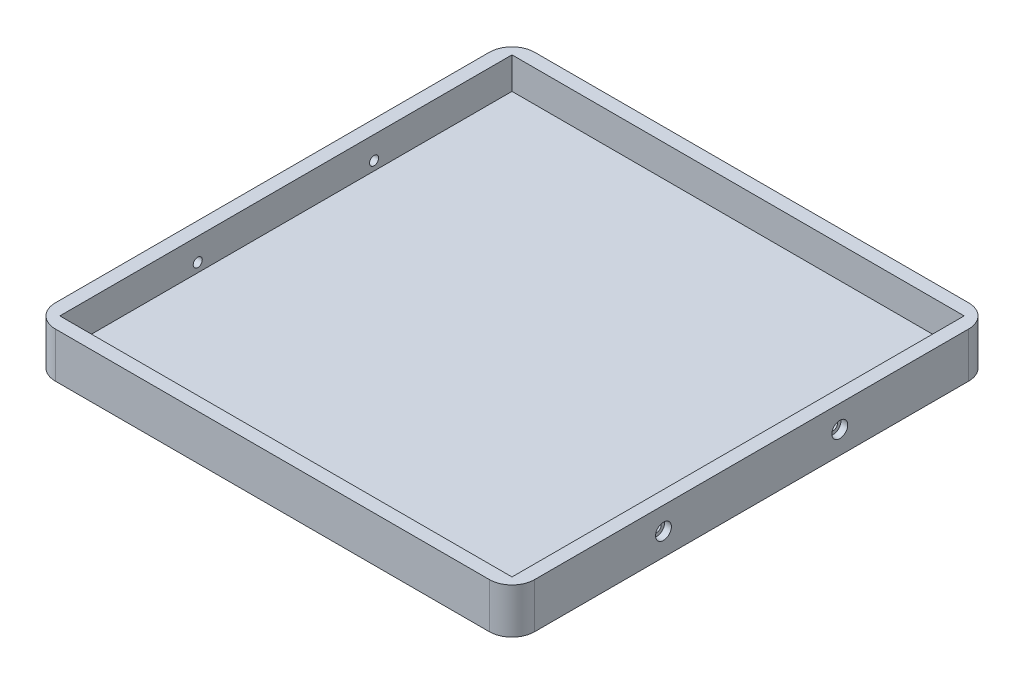
ISO-10303-21;
HEADER;
FILE_DESCRIPTION(('STEP AP214'),'2;1');
FILE_NAME('part.step','',(''),(''),'','','');
FILE_SCHEMA(('AUTOMOTIVE_DESIGN { 1 0 10303 214 1 1 1 1 }'));
ENDSEC;
DATA;
#1=APPLICATION_CONTEXT('core data for automotive mechanical design processes');
#2=APPLICATION_PROTOCOL_DEFINITION('international standard','automotive_design',2000,#1);
#3=PRODUCT_CONTEXT('',#1,'mechanical');
#4=PRODUCT('Part','Part','',(#3));
#5=PRODUCT_RELATED_PRODUCT_CATEGORY('part','',(#4));
#6=PRODUCT_DEFINITION_FORMATION('','',#4);
#7=PRODUCT_DEFINITION_CONTEXT('part definition',#1,'design');
#8=PRODUCT_DEFINITION('design','',#6,#7);
#9=PRODUCT_DEFINITION_SHAPE('','',#8);
#10=(LENGTH_UNIT() NAMED_UNIT(*) SI_UNIT(.MILLI.,.METRE.));
#11=(NAMED_UNIT(*) PLANE_ANGLE_UNIT() SI_UNIT($,.RADIAN.));
#12=(NAMED_UNIT(*) SI_UNIT($,.STERADIAN.) SOLID_ANGLE_UNIT());
#13=UNCERTAINTY_MEASURE_WITH_UNIT(LENGTH_MEASURE(1.E-05),#10,'distance_accuracy_value','');
#14=(GEOMETRIC_REPRESENTATION_CONTEXT(3) GLOBAL_UNCERTAINTY_ASSIGNED_CONTEXT((#13)) GLOBAL_UNIT_ASSIGNED_CONTEXT((#10,
#11,#12)) REPRESENTATION_CONTEXT('',''));
#15=CARTESIAN_POINT('',(0.,0.,0.));
#16=DIRECTION('',(0.,0.,1.));
#17=DIRECTION('',(1.,0.,0.));
#18=AXIS2_PLACEMENT_3D('',#15,#16,#17);
#19=CARTESIAN_POINT('',(-64.0000000000001,5.00000000000054,-19.5));
#20=DIRECTION('',(1.,0.,0.));
#21=DIRECTION('',(0.,0.,-1.));
#22=AXIS2_PLACEMENT_3D('',#19,#20,#21);
#23=CYLINDRICAL_SURFACE('',#22,1.);
#24=CARTESIAN_POINT('',(-50.,5.00000000000054,-19.5));
#25=DIRECTION('',(-1.,0.,0.));
#26=DIRECTION('',(0.,0.,1.));
#27=AXIS2_PLACEMENT_3D('',#24,#25,#26);
#28=CIRCLE('',#27,1.);
#29=CARTESIAN_POINT('',(-50.,5.00000000000054,-18.5));
#30=VERTEX_POINT('',#29);
#31=EDGE_CURVE('E207',#30,#30,#28,.T.);
#32=ORIENTED_EDGE('',*,*,#31,.F.);
#33=EDGE_LOOP('',(#32));
#34=FACE_BOUND('',#33,.T.);
#35=CARTESIAN_POINT('',(-51.5,5.00000000000054,-19.5));
#36=DIRECTION('',(-1.,0.,0.));
#37=DIRECTION('',(0.,0.,1.));
#38=AXIS2_PLACEMENT_3D('',#35,#36,#37);
#39=CIRCLE('',#38,1.);
#40=CARTESIAN_POINT('',(-51.5,5.00000000000054,-18.5));
#41=VERTEX_POINT('',#40);
#42=EDGE_CURVE('E219',#41,#41,#39,.F.);
#43=ORIENTED_EDGE('',*,*,#42,.F.);
#44=EDGE_LOOP('',(#43));
#45=FACE_BOUND('',#44,.T.);
#46=ADVANCED_FACE('F48',(#34,#45),#23,.F.);
#47=CARTESIAN_POINT('',(-64.0000000000001,5.,19.5000000000001));
#48=DIRECTION('',(1.,0.,0.));
#49=DIRECTION('',(0.,0.,-1.));
#50=AXIS2_PLACEMENT_3D('',#47,#48,#49);
#51=CYLINDRICAL_SURFACE('',#50,1.);
#52=CARTESIAN_POINT('',(-50.,5.,19.5000000000001));
#53=DIRECTION('',(-1.,0.,0.));
#54=DIRECTION('',(0.,0.,1.));
#55=AXIS2_PLACEMENT_3D('',#52,#53,#54);
#56=CIRCLE('',#55,1.);
#57=CARTESIAN_POINT('',(-50.,5.,20.5000000000001));
#58=VERTEX_POINT('',#57);
#59=EDGE_CURVE('E212',#58,#58,#56,.T.);
#60=ORIENTED_EDGE('',*,*,#59,.F.);
#61=EDGE_LOOP('',(#60));
#62=FACE_BOUND('',#61,.T.);
#63=CARTESIAN_POINT('',(-51.5,5.,19.5000000000001));
#64=DIRECTION('',(-1.,0.,0.));
#65=DIRECTION('',(0.,0.,1.));
#66=AXIS2_PLACEMENT_3D('',#63,#64,#65);
#67=CIRCLE('',#66,1.);
#68=CARTESIAN_POINT('',(-51.5,5.,20.5000000000001));
#69=VERTEX_POINT('',#68);
#70=EDGE_CURVE('E216',#69,#69,#67,.F.);
#71=ORIENTED_EDGE('',*,*,#70,.F.);
#72=EDGE_LOOP('',(#71));
#73=FACE_BOUND('',#72,.T.);
#74=ADVANCED_FACE('F293',(#62,#73),#51,.F.);
#75=CARTESIAN_POINT('',(53.,10.,-53.));
#76=DIRECTION('',(-1.,0.,0.));
#77=DIRECTION('',(0.,0.,1.));
#78=AXIS2_PLACEMENT_3D('',#75,#76,#77);
#79=PLANE('',#78);
#80=CARTESIAN_POINT('',(53.,5.,19.5000000000001));
#81=DIRECTION('',(1.,0.,0.));
#82=DIRECTION('',(0.,0.,-1.));
#83=AXIS2_PLACEMENT_3D('',#80,#81,#82);
#84=CIRCLE('',#83,1.75);
#85=CARTESIAN_POINT('',(53.,5.,17.7500000000001));
#86=VERTEX_POINT('',#85);
#87=EDGE_CURVE('E333',#86,#86,#84,.T.);
#88=ORIENTED_EDGE('',*,*,#87,.F.);
#89=EDGE_LOOP('',(#88));
#90=FACE_BOUND('',#89,.T.);
#91=DIRECTION('',(0.,0.,-1.));
#92=VECTOR('',#91,1.);
#93=CARTESIAN_POINT('',(53.,10.,-53.));
#94=LINE('',#93,#92);
#95=CARTESIAN_POINT('',(53.,10.,48.));
#96=VERTEX_POINT('',#95);
#97=CARTESIAN_POINT('',(53.,10.,-48.));
#98=VERTEX_POINT('',#97);
#99=EDGE_CURVE('E186',#96,#98,#94,.T.);
#100=ORIENTED_EDGE('',*,*,#99,.F.);
#101=DIRECTION('',(0.,-1.,0.));
#102=VECTOR('',#101,1.);
#103=CARTESIAN_POINT('',(53.,10.,48.));
#104=LINE('',#103,#102);
#105=CARTESIAN_POINT('',(53.,0.,48.));
#106=VERTEX_POINT('',#105);
#107=EDGE_CURVE('E12',#96,#106,#104,.T.);
#108=ORIENTED_EDGE('',*,*,#107,.T.);
#109=DIRECTION('',(0.,0.,-1.));
#110=VECTOR('',#109,1.);
#111=CARTESIAN_POINT('',(53.,0.,-53.));
#112=LINE('',#111,#110);
#113=CARTESIAN_POINT('',(53.,0.,-48.));
#114=VERTEX_POINT('',#113);
#115=EDGE_CURVE('E182',#106,#114,#112,.T.);
#116=ORIENTED_EDGE('',*,*,#115,.T.);
#117=DIRECTION('',(0.,-1.,0.));
#118=VECTOR('',#117,1.);
#119=CARTESIAN_POINT('',(53.,10.,-48.));
#120=LINE('',#119,#118);
#121=EDGE_CURVE('E56',#114,#98,#120,.F.);
#122=ORIENTED_EDGE('',*,*,#121,.T.);
#123=EDGE_LOOP('',(#100,#108,#116,#122));
#124=FACE_BOUND('',#123,.T.);
#125=CARTESIAN_POINT('',(53.,5.00000000000054,-19.5));
#126=DIRECTION('',(1.,0.,0.));
#127=DIRECTION('',(0.,0.,-1.));
#128=AXIS2_PLACEMENT_3D('',#125,#126,#127);
#129=CIRCLE('',#128,1.75);
#130=CARTESIAN_POINT('',(53.,5.00000000000054,-21.25));
#131=VERTEX_POINT('',#130);
#132=EDGE_CURVE('E331',#131,#131,#129,.F.);
#133=ORIENTED_EDGE('',*,*,#132,.T.);
#134=EDGE_LOOP('',(#133));
#135=FACE_BOUND('',#134,.T.);
#136=ADVANCED_FACE('F254',(#90,#124,#135),#79,.F.);
#137=CARTESIAN_POINT('',(-53.,10.,-53.));
#138=DIRECTION('',(0.,0.,1.));
#139=DIRECTION('',(1.,0.,0.));
#140=AXIS2_PLACEMENT_3D('',#137,#138,#139);
#141=PLANE('',#140);
#142=DIRECTION('',(-1.,0.,0.));
#143=VECTOR('',#142,1.);
#144=CARTESIAN_POINT('',(-53.,0.,-53.));
#145=LINE('',#144,#143);
#146=CARTESIAN_POINT('',(48.,0.,-53.));
#147=VERTEX_POINT('',#146);
#148=CARTESIAN_POINT('',(-48.,0.,-53.));
#149=VERTEX_POINT('',#148);
#150=EDGE_CURVE('E200',#147,#149,#145,.T.);
#151=ORIENTED_EDGE('',*,*,#150,.T.);
#152=DIRECTION('',(0.,-1.,0.));
#153=VECTOR('',#152,1.);
#154=CARTESIAN_POINT('',(-48.,10.,-53.));
#155=LINE('',#154,#153);
#156=CARTESIAN_POINT('',(-48.,10.,-53.));
#157=VERTEX_POINT('',#156);
#158=EDGE_CURVE('E239',#149,#157,#155,.F.);
#159=ORIENTED_EDGE('',*,*,#158,.T.);
#160=DIRECTION('',(-1.,0.,0.));
#161=VECTOR('',#160,1.);
#162=CARTESIAN_POINT('',(-53.,10.,-53.));
#163=LINE('',#162,#161);
#164=CARTESIAN_POINT('',(48.,10.,-53.));
#165=VERTEX_POINT('',#164);
#166=EDGE_CURVE('E189',#165,#157,#163,.T.);
#167=ORIENTED_EDGE('',*,*,#166,.F.);
#168=DIRECTION('',(0.,-1.,0.));
#169=VECTOR('',#168,1.);
#170=CARTESIAN_POINT('',(48.,10.,-53.));
#171=LINE('',#170,#169);
#172=EDGE_CURVE('E236',#165,#147,#171,.T.);
#173=ORIENTED_EDGE('',*,*,#172,.T.);
#174=EDGE_LOOP('',(#151,#159,#167,#173));
#175=FACE_BOUND('',#174,.T.);
#176=ADVANCED_FACE('F266',(#175),#141,.F.);
#177=CARTESIAN_POINT('',(-53.,10.,-53.));
#178=DIRECTION('',(1.,0.,0.));
#179=DIRECTION('',(0.,0.,-1.));
#180=AXIS2_PLACEMENT_3D('',#177,#178,#179);
#181=PLANE('',#180);
#182=CARTESIAN_POINT('',(-53.,5.00000000000054,-19.5));
#183=DIRECTION('',(-1.,0.,0.));
#184=DIRECTION('',(0.,0.,1.));
#185=AXIS2_PLACEMENT_3D('',#182,#183,#184);
#186=CIRCLE('',#185,1.75);
#187=CARTESIAN_POINT('',(-53.,5.00000000000054,-17.75));
#188=VERTEX_POINT('',#187);
#189=EDGE_CURVE('E415',#188,#188,#186,.T.);
#190=ORIENTED_EDGE('',*,*,#189,.F.);
#191=EDGE_LOOP('',(#190));
#192=FACE_BOUND('',#191,.T.);
#193=CARTESIAN_POINT('',(-53.,5.,19.5000000000001));
#194=DIRECTION('',(-1.,0.,0.));
#195=DIRECTION('',(0.,0.,1.));
#196=AXIS2_PLACEMENT_3D('',#193,#194,#195);
#197=CIRCLE('',#196,1.75);
#198=CARTESIAN_POINT('',(-53.,5.,21.2500000000001));
#199=VERTEX_POINT('',#198);
#200=EDGE_CURVE('E412',#199,#199,#197,.T.);
#201=ORIENTED_EDGE('',*,*,#200,.F.);
#202=EDGE_LOOP('',(#201));
#203=FACE_BOUND('',#202,.T.);
#204=DIRECTION('',(0.,0.,1.));
#205=VECTOR('',#204,1.);
#206=CARTESIAN_POINT('',(-53.,10.,-53.));
#207=LINE('',#206,#205);
#208=CARTESIAN_POINT('',(-53.,10.,-48.));
#209=VERTEX_POINT('',#208);
#210=CARTESIAN_POINT('',(-53.,10.,48.));
#211=VERTEX_POINT('',#210);
#212=EDGE_CURVE('E193',#209,#211,#207,.T.);
#213=ORIENTED_EDGE('',*,*,#212,.F.);
#214=DIRECTION('',(0.,-1.,0.));
#215=VECTOR('',#214,1.);
#216=CARTESIAN_POINT('',(-53.,10.,-48.));
#217=LINE('',#216,#215);
#218=CARTESIAN_POINT('',(-53.,0.,-48.));
#219=VERTEX_POINT('',#218);
#220=EDGE_CURVE('E225',#209,#219,#217,.T.);
#221=ORIENTED_EDGE('',*,*,#220,.T.);
#222=DIRECTION('',(0.,0.,1.));
#223=VECTOR('',#222,1.);
#224=CARTESIAN_POINT('',(-53.,0.,-53.));
#225=LINE('',#224,#223);
#226=CARTESIAN_POINT('',(-53.,0.,48.));
#227=VERTEX_POINT('',#226);
#228=EDGE_CURVE('E203',#219,#227,#225,.T.);
#229=ORIENTED_EDGE('',*,*,#228,.T.);
#230=DIRECTION('',(0.,-1.,0.));
#231=VECTOR('',#230,1.);
#232=CARTESIAN_POINT('',(-53.,10.,48.));
#233=LINE('',#232,#231);
#234=EDGE_CURVE('E197',#227,#211,#233,.F.);
#235=ORIENTED_EDGE('',*,*,#234,.T.);
#236=EDGE_LOOP('',(#213,#221,#229,#235));
#237=FACE_BOUND('',#236,.T.);
#238=ADVANCED_FACE('F277',(#192,#203,#237),#181,.F.);
#239=CARTESIAN_POINT('',(-53.,10.,53.));
#240=DIRECTION('',(0.,0.,-1.));
#241=DIRECTION('',(-1.,0.,0.));
#242=AXIS2_PLACEMENT_3D('',#239,#240,#241);
#243=PLANE('',#242);
#244=DIRECTION('',(1.,0.,0.));
#245=VECTOR('',#244,1.);
#246=CARTESIAN_POINT('',(-53.,10.,53.));
#247=LINE('',#246,#245);
#248=CARTESIAN_POINT('',(-48.,10.,53.));
#249=VERTEX_POINT('',#248);
#250=CARTESIAN_POINT('',(48.,10.,53.));
#251=VERTEX_POINT('',#250);
#252=EDGE_CURVE('E195',#249,#251,#247,.T.);
#253=ORIENTED_EDGE('',*,*,#252,.F.);
#254=DIRECTION('',(0.,-1.,0.));
#255=VECTOR('',#254,1.);
#256=CARTESIAN_POINT('',(-48.,10.,53.));
#257=LINE('',#256,#255);
#258=CARTESIAN_POINT('',(-48.,0.,53.));
#259=VERTEX_POINT('',#258);
#260=EDGE_CURVE('E249',#249,#259,#257,.T.);
#261=ORIENTED_EDGE('',*,*,#260,.T.);
#262=DIRECTION('',(1.,0.,0.));
#263=VECTOR('',#262,1.);
#264=CARTESIAN_POINT('',(-53.,0.,53.));
#265=LINE('',#264,#263);
#266=CARTESIAN_POINT('',(48.,0.,53.));
#267=VERTEX_POINT('',#266);
#268=EDGE_CURVE('E190',#259,#267,#265,.T.);
#269=ORIENTED_EDGE('',*,*,#268,.T.);
#270=DIRECTION('',(0.,-1.,0.));
#271=VECTOR('',#270,1.);
#272=CARTESIAN_POINT('',(48.,10.,53.));
#273=LINE('',#272,#271);
#274=EDGE_CURVE('E63',#267,#251,#273,.F.);
#275=ORIENTED_EDGE('',*,*,#274,.T.);
#276=EDGE_LOOP('',(#253,#261,#269,#275));
#277=FACE_BOUND('',#276,.T.);
#278=ADVANCED_FACE('F283',(#277),#243,.F.);
#279=CARTESIAN_POINT('',(0.,10.,0.));
#280=DIRECTION('',(0.,1.,0.));
#281=DIRECTION('',(0.,0.,1.));
#282=AXIS2_PLACEMENT_3D('',#279,#280,#281);
#283=PLANE('',#282);
#284=DIRECTION('',(0.,0.,-1.));
#285=VECTOR('',#284,1.);
#286=CARTESIAN_POINT('',(50.,10.,-50.));
#287=LINE('',#286,#285);
#288=CARTESIAN_POINT('',(50.,10.,50.));
#289=VERTEX_POINT('',#288);
#290=CARTESIAN_POINT('',(50.,10.,-50.));
#291=VERTEX_POINT('',#290);
#292=EDGE_CURVE('E146',#289,#291,#287,.T.);
#293=ORIENTED_EDGE('',*,*,#292,.F.);
#294=DIRECTION('',(1.,0.,0.));
#295=VECTOR('',#294,1.);
#296=CARTESIAN_POINT('',(-50.,10.,50.));
#297=LINE('',#296,#295);
#298=CARTESIAN_POINT('',(-50.,10.,50.));
#299=VERTEX_POINT('',#298);
#300=EDGE_CURVE('E163',#299,#289,#297,.T.);
#301=ORIENTED_EDGE('',*,*,#300,.F.);
#302=DIRECTION('',(0.,0.,1.));
#303=VECTOR('',#302,1.);
#304=CARTESIAN_POINT('',(-50.,10.,-50.));
#305=LINE('',#304,#303);
#306=CARTESIAN_POINT('',(-50.,10.,-50.));
#307=VERTEX_POINT('',#306);
#308=EDGE_CURVE('E166',#307,#299,#305,.T.);
#309=ORIENTED_EDGE('',*,*,#308,.F.);
#310=DIRECTION('',(-1.,0.,0.));
#311=VECTOR('',#310,1.);
#312=CARTESIAN_POINT('',(-50.,10.,-50.));
#313=LINE('',#312,#311);
#314=EDGE_CURVE('E175',#291,#307,#313,.T.);
#315=ORIENTED_EDGE('',*,*,#314,.F.);
#316=EDGE_LOOP('',(#293,#301,#309,#315));
#317=FACE_BOUND('',#316,.T.);
#318=ORIENTED_EDGE('',*,*,#166,.T.);
#319=CARTESIAN_POINT('',(-48.,10.,-48.));
#320=DIRECTION('',(0.,1.,0.));
#321=DIRECTION('',(0.,0.,1.));
#322=AXIS2_PLACEMENT_3D('',#319,#320,#321);
#323=CIRCLE('',#322,5.);
#324=EDGE_CURVE('E246',#157,#209,#323,.T.);
#325=ORIENTED_EDGE('',*,*,#324,.T.);
#326=ORIENTED_EDGE('',*,*,#212,.T.);
#327=CARTESIAN_POINT('',(-48.,10.,48.));
#328=DIRECTION('',(0.,1.,0.));
#329=DIRECTION('',(0.,0.,1.));
#330=AXIS2_PLACEMENT_3D('',#327,#328,#329);
#331=CIRCLE('',#330,5.);
#332=EDGE_CURVE('E70',#211,#249,#331,.T.);
#333=ORIENTED_EDGE('',*,*,#332,.T.);
#334=ORIENTED_EDGE('',*,*,#252,.T.);
#335=CARTESIAN_POINT('',(48.,10.,48.));
#336=DIRECTION('',(0.,1.,0.));
#337=DIRECTION('',(0.,0.,1.));
#338=AXIS2_PLACEMENT_3D('',#335,#336,#337);
#339=CIRCLE('',#338,5.);
#340=EDGE_CURVE('E243',#251,#96,#339,.T.);
#341=ORIENTED_EDGE('',*,*,#340,.T.);
#342=ORIENTED_EDGE('',*,*,#99,.T.);
#343=CARTESIAN_POINT('',(48.,10.,-48.));
#344=DIRECTION('',(0.,1.,0.));
#345=DIRECTION('',(0.,0.,1.));
#346=AXIS2_PLACEMENT_3D('',#343,#344,#345);
#347=CIRCLE('',#346,5.);
#348=EDGE_CURVE('E241',#98,#165,#347,.T.);
#349=ORIENTED_EDGE('',*,*,#348,.T.);
#350=EDGE_LOOP('',(#318,#325,#326,#333,#334,#341,#342,#349));
#351=FACE_BOUND('',#350,.T.);
#352=ADVANCED_FACE('F260',(#317,#351),#283,.T.);
#353=CARTESIAN_POINT('',(0.,0.,0.));
#354=DIRECTION('',(0.,1.,0.));
#355=DIRECTION('',(0.,0.,1.));
#356=AXIS2_PLACEMENT_3D('',#353,#354,#355);
#357=PLANE('',#356);
#358=ORIENTED_EDGE('',*,*,#228,.F.);
#359=CARTESIAN_POINT('',(-48.,0.,-48.));
#360=DIRECTION('',(0.,1.,0.));
#361=DIRECTION('',(0.,0.,1.));
#362=AXIS2_PLACEMENT_3D('',#359,#360,#361);
#363=CIRCLE('',#362,5.);
#364=EDGE_CURVE('E234',#219,#149,#363,.F.);
#365=ORIENTED_EDGE('',*,*,#364,.T.);
#366=ORIENTED_EDGE('',*,*,#150,.F.);
#367=CARTESIAN_POINT('',(48.,0.,-48.));
#368=DIRECTION('',(0.,1.,0.));
#369=DIRECTION('',(0.,0.,1.));
#370=AXIS2_PLACEMENT_3D('',#367,#368,#369);
#371=CIRCLE('',#370,5.);
#372=EDGE_CURVE('E228',#147,#114,#371,.F.);
#373=ORIENTED_EDGE('',*,*,#372,.T.);
#374=ORIENTED_EDGE('',*,*,#115,.F.);
#375=CARTESIAN_POINT('',(48.,0.,48.));
#376=DIRECTION('',(0.,1.,0.));
#377=DIRECTION('',(0.,0.,1.));
#378=AXIS2_PLACEMENT_3D('',#375,#376,#377);
#379=CIRCLE('',#378,5.);
#380=EDGE_CURVE('E230',#106,#267,#379,.F.);
#381=ORIENTED_EDGE('',*,*,#380,.T.);
#382=ORIENTED_EDGE('',*,*,#268,.F.);
#383=CARTESIAN_POINT('',(-48.,0.,48.));
#384=DIRECTION('',(0.,1.,0.));
#385=DIRECTION('',(0.,0.,1.));
#386=AXIS2_PLACEMENT_3D('',#383,#384,#385);
#387=CIRCLE('',#386,5.);
#388=EDGE_CURVE('E232',#259,#227,#387,.F.);
#389=ORIENTED_EDGE('',*,*,#388,.T.);
#390=EDGE_LOOP('',(#358,#365,#366,#373,#374,#381,#382,#389));
#391=FACE_BOUND('',#390,.T.);
#392=ADVANCED_FACE('F270',(#391),#357,.F.);
#393=CARTESIAN_POINT('',(50.,3.,-50.));
#394=DIRECTION('',(1.,0.,0.));
#395=DIRECTION('',(0.,0.,-1.));
#396=AXIS2_PLACEMENT_3D('',#393,#394,#395);
#397=PLANE('',#396);
#398=CARTESIAN_POINT('',(50.,5.,19.5000000000001));
#399=DIRECTION('',(1.,0.,0.));
#400=DIRECTION('',(0.,0.,-1.));
#401=AXIS2_PLACEMENT_3D('',#398,#399,#400);
#402=CIRCLE('',#401,1.);
#403=CARTESIAN_POINT('',(50.,5.,18.5000000000001));
#404=VERTEX_POINT('',#403);
#405=EDGE_CURVE('E215',#404,#404,#402,.T.);
#406=ORIENTED_EDGE('',*,*,#405,.T.);
#407=EDGE_LOOP('',(#406));
#408=FACE_BOUND('',#407,.T.);
#409=CARTESIAN_POINT('',(50.,5.00000000000054,-19.5));
#410=DIRECTION('',(1.,0.,0.));
#411=DIRECTION('',(0.,0.,-1.));
#412=AXIS2_PLACEMENT_3D('',#409,#410,#411);
#413=CIRCLE('',#412,1.);
#414=CARTESIAN_POINT('',(50.,5.00000000000054,-20.5));
#415=VERTEX_POINT('',#414);
#416=EDGE_CURVE('E210',#415,#415,#413,.T.);
#417=ORIENTED_EDGE('',*,*,#416,.T.);
#418=EDGE_LOOP('',(#417));
#419=FACE_BOUND('',#418,.T.);
#420=ORIENTED_EDGE('',*,*,#292,.T.);
#421=DIRECTION('',(0.,1.,0.));
#422=VECTOR('',#421,1.);
#423=CARTESIAN_POINT('',(50.,3.,-50.));
#424=LINE('',#423,#422);
#425=CARTESIAN_POINT('',(50.,3.,-50.));
#426=VERTEX_POINT('',#425);
#427=EDGE_CURVE('E139',#426,#291,#424,.T.);
#428=ORIENTED_EDGE('',*,*,#427,.F.);
#429=DIRECTION('',(0.,0.,-1.));
#430=VECTOR('',#429,1.);
#431=CARTESIAN_POINT('',(50.,3.,-50.));
#432=LINE('',#431,#430);
#433=CARTESIAN_POINT('',(50.,3.,50.));
#434=VERTEX_POINT('',#433);
#435=EDGE_CURVE('E143',#434,#426,#432,.T.);
#436=ORIENTED_EDGE('',*,*,#435,.F.);
#437=DIRECTION('',(0.,1.,0.));
#438=VECTOR('',#437,1.);
#439=CARTESIAN_POINT('',(50.,3.,50.));
#440=LINE('',#439,#438);
#441=EDGE_CURVE('E180',#434,#289,#440,.T.);
#442=ORIENTED_EDGE('',*,*,#441,.T.);
#443=EDGE_LOOP('',(#420,#428,#436,#442));
#444=FACE_BOUND('',#443,.T.);
#445=ADVANCED_FACE('F141',(#408,#419,#444),#397,.F.);
#446=CARTESIAN_POINT('',(-50.,3.,50.));
#447=DIRECTION('',(0.,0.,1.));
#448=DIRECTION('',(1.,0.,0.));
#449=AXIS2_PLACEMENT_3D('',#446,#447,#448);
#450=PLANE('',#449);
#451=ORIENTED_EDGE('',*,*,#300,.T.);
#452=ORIENTED_EDGE('',*,*,#441,.F.);
#453=DIRECTION('',(1.,0.,0.));
#454=VECTOR('',#453,1.);
#455=CARTESIAN_POINT('',(-50.,3.,50.));
#456=LINE('',#455,#454);
#457=CARTESIAN_POINT('',(-50.,3.,50.));
#458=VERTEX_POINT('',#457);
#459=EDGE_CURVE('E151',#458,#434,#456,.T.);
#460=ORIENTED_EDGE('',*,*,#459,.F.);
#461=DIRECTION('',(0.,1.,0.));
#462=VECTOR('',#461,1.);
#463=CARTESIAN_POINT('',(-50.,3.,50.));
#464=LINE('',#463,#462);
#465=EDGE_CURVE('E183',#458,#299,#464,.T.);
#466=ORIENTED_EDGE('',*,*,#465,.T.);
#467=EDGE_LOOP('',(#451,#452,#460,#466));
#468=FACE_BOUND('',#467,.T.);
#469=ADVANCED_FACE('F354',(#468),#450,.F.);
#470=CARTESIAN_POINT('',(-50.,3.,-50.));
#471=DIRECTION('',(-1.,0.,0.));
#472=DIRECTION('',(0.,0.,1.));
#473=AXIS2_PLACEMENT_3D('',#470,#471,#472);
#474=PLANE('',#473);
#475=ORIENTED_EDGE('',*,*,#59,.T.);
#476=EDGE_LOOP('',(#475));
#477=FACE_BOUND('',#476,.T.);
#478=ORIENTED_EDGE('',*,*,#31,.T.);
#479=EDGE_LOOP('',(#478));
#480=FACE_BOUND('',#479,.T.);
#481=ORIENTED_EDGE('',*,*,#308,.T.);
#482=ORIENTED_EDGE('',*,*,#465,.F.);
#483=DIRECTION('',(0.,0.,1.));
#484=VECTOR('',#483,1.);
#485=CARTESIAN_POINT('',(-50.,3.,-50.));
#486=LINE('',#485,#484);
#487=CARTESIAN_POINT('',(-50.,3.,-50.));
#488=VERTEX_POINT('',#487);
#489=EDGE_CURVE('E159',#488,#458,#486,.T.);
#490=ORIENTED_EDGE('',*,*,#489,.F.);
#491=DIRECTION('',(0.,1.,0.));
#492=VECTOR('',#491,1.);
#493=CARTESIAN_POINT('',(-50.,3.,-50.));
#494=LINE('',#493,#492);
#495=EDGE_CURVE('E150',#488,#307,#494,.T.);
#496=ORIENTED_EDGE('',*,*,#495,.T.);
#497=EDGE_LOOP('',(#481,#482,#490,#496));
#498=FACE_BOUND('',#497,.T.);
#499=ADVANCED_FACE('F357',(#477,#480,#498),#474,.F.);
#500=CARTESIAN_POINT('',(-50.,3.,-50.));
#501=DIRECTION('',(0.,0.,-1.));
#502=DIRECTION('',(-1.,0.,0.));
#503=AXIS2_PLACEMENT_3D('',#500,#501,#502);
#504=PLANE('',#503);
#505=ORIENTED_EDGE('',*,*,#314,.T.);
#506=ORIENTED_EDGE('',*,*,#495,.F.);
#507=DIRECTION('',(-1.,0.,0.));
#508=VECTOR('',#507,1.);
#509=CARTESIAN_POINT('',(-50.,3.,-50.));
#510=LINE('',#509,#508);
#511=EDGE_CURVE('E154',#426,#488,#510,.T.);
#512=ORIENTED_EDGE('',*,*,#511,.F.);
#513=ORIENTED_EDGE('',*,*,#427,.T.);
#514=EDGE_LOOP('',(#505,#506,#512,#513));
#515=FACE_BOUND('',#514,.T.);
#516=ADVANCED_FACE('F155',(#515),#504,.F.);
#517=CARTESIAN_POINT('',(0.,3.,0.));
#518=DIRECTION('',(0.,1.,0.));
#519=DIRECTION('',(0.,0.,1.));
#520=AXIS2_PLACEMENT_3D('',#517,#518,#519);
#521=PLANE('',#520);
#522=ORIENTED_EDGE('',*,*,#435,.T.);
#523=ORIENTED_EDGE('',*,*,#511,.T.);
#524=ORIENTED_EDGE('',*,*,#489,.T.);
#525=ORIENTED_EDGE('',*,*,#459,.T.);
#526=EDGE_LOOP('',(#522,#523,#524,#525));
#527=FACE_BOUND('',#526,.T.);
#528=ADVANCED_FACE('F161',(#527),#521,.T.);
#529=CARTESIAN_POINT('',(51.5,5.,19.5000000000001));
#530=DIRECTION('',(1.,0.,0.));
#531=DIRECTION('',(0.,0.,-1.));
#532=AXIS2_PLACEMENT_3D('',#529,#530,#531);
#533=CYLINDRICAL_SURFACE('',#532,1.75);
#534=ORIENTED_EDGE('',*,*,#87,.T.);
#535=EDGE_LOOP('',(#534));
#536=FACE_BOUND('',#535,.T.);
#537=CARTESIAN_POINT('',(51.5,5.,19.5000000000001));
#538=DIRECTION('',(1.,0.,0.));
#539=DIRECTION('',(0.,0.,-1.));
#540=AXIS2_PLACEMENT_3D('',#537,#538,#539);
#541=CIRCLE('',#540,1.75);
#542=CARTESIAN_POINT('',(51.5,5.,17.7500000000001));
#543=VERTEX_POINT('',#542);
#544=EDGE_CURVE('E169',#543,#543,#541,.T.);
#545=ORIENTED_EDGE('',*,*,#544,.F.);
#546=EDGE_LOOP('',(#545));
#547=FACE_BOUND('',#546,.T.);
#548=ADVANCED_FACE('F342',(#536,#547),#533,.F.);
#549=CARTESIAN_POINT('',(51.5,0.,0.));
#550=DIRECTION('',(1.,0.,0.));
#551=DIRECTION('',(0.,0.,-1.));
#552=AXIS2_PLACEMENT_3D('',#549,#550,#551);
#553=PLANE('',#552);
#554=CARTESIAN_POINT('',(51.5,5.,19.5000000000001));
#555=DIRECTION('',(1.,0.,0.));
#556=DIRECTION('',(0.,0.,-1.));
#557=AXIS2_PLACEMENT_3D('',#554,#555,#556);
#558=CIRCLE('',#557,1.);
#559=CARTESIAN_POINT('',(51.5,5.,18.5000000000001));
#560=VERTEX_POINT('',#559);
#561=EDGE_CURVE('E211',#560,#560,#558,.T.);
#562=ORIENTED_EDGE('',*,*,#561,.F.);
#563=EDGE_LOOP('',(#562));
#564=FACE_BOUND('',#563,.T.);
#565=ORIENTED_EDGE('',*,*,#544,.T.);
#566=EDGE_LOOP('',(#565));
#567=FACE_BOUND('',#566,.T.);
#568=ADVANCED_FACE('F340',(#564,#567),#553,.T.);
#569=CARTESIAN_POINT('',(51.5,5.00000000000054,-19.5));
#570=DIRECTION('',(1.,0.,0.));
#571=DIRECTION('',(0.,0.,-1.));
#572=AXIS2_PLACEMENT_3D('',#569,#570,#571);
#573=CYLINDRICAL_SURFACE('',#572,1.75);
#574=CARTESIAN_POINT('',(51.5,5.00000000000054,-19.5));
#575=DIRECTION('',(1.,0.,0.));
#576=DIRECTION('',(0.,0.,-1.));
#577=AXIS2_PLACEMENT_3D('',#574,#575,#576);
#578=CIRCLE('',#577,1.75);
#579=CARTESIAN_POINT('',(51.5,5.00000000000054,-21.25));
#580=VERTEX_POINT('',#579);
#581=EDGE_CURVE('E176',#580,#580,#578,.F.);
#582=ORIENTED_EDGE('',*,*,#581,.T.);
#583=EDGE_LOOP('',(#582));
#584=FACE_BOUND('',#583,.T.);
#585=ORIENTED_EDGE('',*,*,#132,.F.);
#586=EDGE_LOOP('',(#585));
#587=FACE_BOUND('',#586,.T.);
#588=ADVANCED_FACE('F315',(#584,#587),#573,.F.);
#589=CARTESIAN_POINT('',(51.5,0.,0.));
#590=DIRECTION('',(1.,0.,0.));
#591=DIRECTION('',(0.,0.,-1.));
#592=AXIS2_PLACEMENT_3D('',#589,#590,#591);
#593=PLANE('',#592);
#594=CARTESIAN_POINT('',(51.5,5.00000000000054,-19.5));
#595=DIRECTION('',(1.,0.,0.));
#596=DIRECTION('',(0.,0.,-1.));
#597=AXIS2_PLACEMENT_3D('',#594,#595,#596);
#598=CIRCLE('',#597,1.);
#599=CARTESIAN_POINT('',(51.5,5.00000000000054,-20.5));
#600=VERTEX_POINT('',#599);
#601=EDGE_CURVE('E223',#600,#600,#598,.T.);
#602=ORIENTED_EDGE('',*,*,#601,.F.);
#603=EDGE_LOOP('',(#602));
#604=FACE_BOUND('',#603,.T.);
#605=ORIENTED_EDGE('',*,*,#581,.F.);
#606=EDGE_LOOP('',(#605));
#607=FACE_BOUND('',#606,.T.);
#608=ADVANCED_FACE('F307',(#604,#607),#593,.T.);
#609=ORIENTED_EDGE('',*,*,#601,.T.);
#610=EDGE_LOOP('',(#609));
#611=FACE_BOUND('',#610,.T.);
#612=ORIENTED_EDGE('',*,*,#416,.F.);
#613=EDGE_LOOP('',(#612));
#614=FACE_BOUND('',#613,.T.);
#615=ADVANCED_FACE('F296',(#611,#614),#23,.F.);
#616=ORIENTED_EDGE('',*,*,#561,.T.);
#617=EDGE_LOOP('',(#616));
#618=FACE_BOUND('',#617,.T.);
#619=ORIENTED_EDGE('',*,*,#405,.F.);
#620=EDGE_LOOP('',(#619));
#621=FACE_BOUND('',#620,.T.);
#622=ADVANCED_FACE('F302',(#618,#621),#51,.F.);
#623=CARTESIAN_POINT('',(-51.5,5.,19.5000000000001));
#624=DIRECTION('',(-1.,0.,0.));
#625=DIRECTION('',(0.,0.,1.));
#626=AXIS2_PLACEMENT_3D('',#623,#624,#625);
#627=PLANE('',#626);
#628=CARTESIAN_POINT('',(-51.5,5.,19.5000000000001));
#629=DIRECTION('',(-1.,0.,0.));
#630=DIRECTION('',(0.,0.,1.));
#631=AXIS2_PLACEMENT_3D('',#628,#629,#630);
#632=CIRCLE('',#631,1.75);
#633=CARTESIAN_POINT('',(-51.5,5.,21.2500000000001));
#634=VERTEX_POINT('',#633);
#635=EDGE_CURVE('E409',#634,#634,#632,.T.);
#636=ORIENTED_EDGE('',*,*,#635,.T.);
#637=EDGE_LOOP('',(#636));
#638=FACE_BOUND('',#637,.T.);
#639=ORIENTED_EDGE('',*,*,#70,.T.);
#640=EDGE_LOOP('',(#639));
#641=FACE_BOUND('',#640,.T.);
#642=ADVANCED_FACE('F313',(#638,#641),#627,.T.);
#643=CARTESIAN_POINT('',(-51.5,5.,19.5000000000001));
#644=DIRECTION('',(-1.,0.,0.));
#645=DIRECTION('',(0.,0.,1.));
#646=AXIS2_PLACEMENT_3D('',#643,#644,#645);
#647=CYLINDRICAL_SURFACE('',#646,1.75);
#648=ORIENTED_EDGE('',*,*,#635,.F.);
#649=EDGE_LOOP('',(#648));
#650=FACE_BOUND('',#649,.T.);
#651=ORIENTED_EDGE('',*,*,#200,.T.);
#652=EDGE_LOOP('',(#651));
#653=FACE_BOUND('',#652,.T.);
#654=ADVANCED_FACE('F393',(#650,#653),#647,.F.);
#655=CARTESIAN_POINT('',(-51.5,5.00000000000054,-19.5));
#656=DIRECTION('',(-1.,0.,0.));
#657=DIRECTION('',(0.,0.,1.));
#658=AXIS2_PLACEMENT_3D('',#655,#656,#657);
#659=PLANE('',#658);
#660=CARTESIAN_POINT('',(-51.5,5.00000000000054,-19.5));
#661=DIRECTION('',(-1.,0.,0.));
#662=DIRECTION('',(0.,0.,1.));
#663=AXIS2_PLACEMENT_3D('',#660,#661,#662);
#664=CIRCLE('',#663,1.75);
#665=CARTESIAN_POINT('',(-51.5,5.00000000000054,-17.75));
#666=VERTEX_POINT('',#665);
#667=EDGE_CURVE('E220',#666,#666,#664,.T.);
#668=ORIENTED_EDGE('',*,*,#667,.T.);
#669=EDGE_LOOP('',(#668));
#670=FACE_BOUND('',#669,.T.);
#671=ORIENTED_EDGE('',*,*,#42,.T.);
#672=EDGE_LOOP('',(#671));
#673=FACE_BOUND('',#672,.T.);
#674=ADVANCED_FACE('F387',(#670,#673),#659,.T.);
#675=CARTESIAN_POINT('',(-51.5,5.00000000000054,-19.5));
#676=DIRECTION('',(-1.,0.,0.));
#677=DIRECTION('',(0.,0.,1.));
#678=AXIS2_PLACEMENT_3D('',#675,#676,#677);
#679=CYLINDRICAL_SURFACE('',#678,1.75);
#680=ORIENTED_EDGE('',*,*,#667,.F.);
#681=EDGE_LOOP('',(#680));
#682=FACE_BOUND('',#681,.T.);
#683=ORIENTED_EDGE('',*,*,#189,.T.);
#684=EDGE_LOOP('',(#683));
#685=FACE_BOUND('',#684,.T.);
#686=ADVANCED_FACE('F383',(#682,#685),#679,.F.);
#687=CARTESIAN_POINT('',(-48.,10.,-48.));
#688=DIRECTION('',(0.,-1.,0.));
#689=DIRECTION('',(0.,0.,-1.));
#690=AXIS2_PLACEMENT_3D('',#687,#688,#689);
#691=CYLINDRICAL_SURFACE('',#690,5.);
#692=ORIENTED_EDGE('',*,*,#324,.F.);
#693=ORIENTED_EDGE('',*,*,#158,.F.);
#694=ORIENTED_EDGE('',*,*,#364,.F.);
#695=ORIENTED_EDGE('',*,*,#220,.F.);
#696=EDGE_LOOP('',(#692,#693,#694,#695));
#697=FACE_BOUND('',#696,.T.);
#698=ADVANCED_FACE('F274',(#697),#691,.T.);
#699=CARTESIAN_POINT('',(-48.,10.,48.));
#700=DIRECTION('',(0.,-1.,0.));
#701=DIRECTION('',(0.,0.,-1.));
#702=AXIS2_PLACEMENT_3D('',#699,#700,#701);
#703=CYLINDRICAL_SURFACE('',#702,5.);
#704=ORIENTED_EDGE('',*,*,#332,.F.);
#705=ORIENTED_EDGE('',*,*,#234,.F.);
#706=ORIENTED_EDGE('',*,*,#388,.F.);
#707=ORIENTED_EDGE('',*,*,#260,.F.);
#708=EDGE_LOOP('',(#704,#705,#706,#707));
#709=FACE_BOUND('',#708,.T.);
#710=ADVANCED_FACE('F281',(#709),#703,.T.);
#711=CARTESIAN_POINT('',(48.,10.,48.));
#712=DIRECTION('',(0.,-1.,0.));
#713=DIRECTION('',(0.,0.,-1.));
#714=AXIS2_PLACEMENT_3D('',#711,#712,#713);
#715=CYLINDRICAL_SURFACE('',#714,5.);
#716=ORIENTED_EDGE('',*,*,#340,.F.);
#717=ORIENTED_EDGE('',*,*,#274,.F.);
#718=ORIENTED_EDGE('',*,*,#380,.F.);
#719=ORIENTED_EDGE('',*,*,#107,.F.);
#720=EDGE_LOOP('',(#716,#717,#718,#719));
#721=FACE_BOUND('',#720,.T.);
#722=ADVANCED_FACE('F285',(#721),#715,.T.);
#723=CARTESIAN_POINT('',(48.,10.,-48.));
#724=DIRECTION('',(0.,-1.,0.));
#725=DIRECTION('',(0.,0.,-1.));
#726=AXIS2_PLACEMENT_3D('',#723,#724,#725);
#727=CYLINDRICAL_SURFACE('',#726,5.);
#728=ORIENTED_EDGE('',*,*,#348,.F.);
#729=ORIENTED_EDGE('',*,*,#121,.F.);
#730=ORIENTED_EDGE('',*,*,#372,.F.);
#731=ORIENTED_EDGE('',*,*,#172,.F.);
#732=EDGE_LOOP('',(#728,#729,#730,#731));
#733=FACE_BOUND('',#732,.T.);
#734=ADVANCED_FACE('F50',(#733),#727,.T.);
#735=CLOSED_SHELL('',(#46,#74,#136,#176,#238,#278,#352,#392,#445,#469,#499,#516,#528,#548,#568,
#588,#608,#615,#622,#642,#654,#674,#686,#698,#710,#722,#734));
#736=MANIFOLD_SOLID_BREP('B2',#735);
#737=ADVANCED_BREP_SHAPE_REPRESENTATION('',(#18,#736),#14);
#738=SHAPE_DEFINITION_REPRESENTATION(#9,#737);
ENDSEC;
END-ISO-10303-21;
